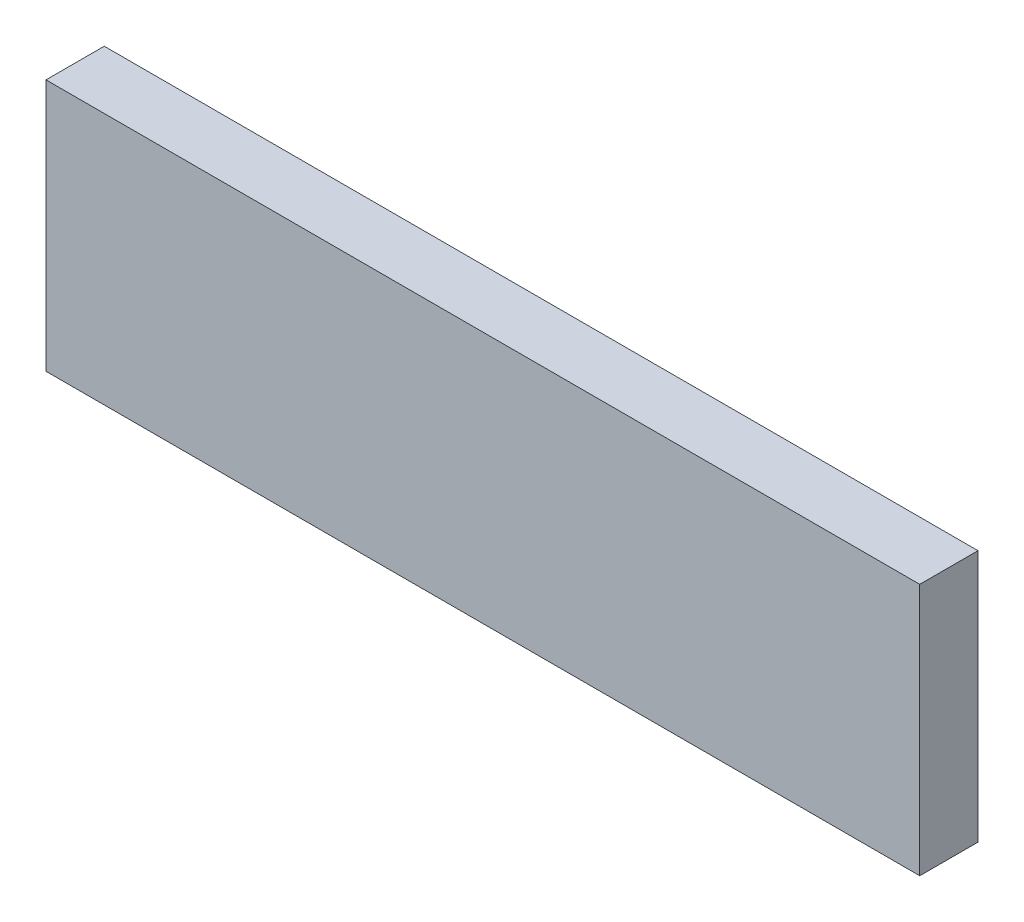
ISO-10303-21;
HEADER;
FILE_DESCRIPTION(('STEP AP214'),'2;1');
FILE_NAME('part.step','',(''),(''),'','','');
FILE_SCHEMA(('AUTOMOTIVE_DESIGN { 1 0 10303 214 1 1 1 1 }'));
ENDSEC;
DATA;
#1=APPLICATION_CONTEXT('core data for automotive mechanical design processes');
#2=APPLICATION_PROTOCOL_DEFINITION('international standard','automotive_design',2000,#1);
#3=PRODUCT_CONTEXT('',#1,'mechanical');
#4=PRODUCT('Part','Part','',(#3));
#5=PRODUCT_RELATED_PRODUCT_CATEGORY('part','',(#4));
#6=PRODUCT_DEFINITION_FORMATION('','',#4);
#7=PRODUCT_DEFINITION_CONTEXT('part definition',#1,'design');
#8=PRODUCT_DEFINITION('design','',#6,#7);
#9=PRODUCT_DEFINITION_SHAPE('','',#8);
#10=(LENGTH_UNIT() NAMED_UNIT(*) SI_UNIT(.MILLI.,.METRE.));
#11=(NAMED_UNIT(*) PLANE_ANGLE_UNIT() SI_UNIT($,.RADIAN.));
#12=(NAMED_UNIT(*) SI_UNIT($,.STERADIAN.) SOLID_ANGLE_UNIT());
#13=UNCERTAINTY_MEASURE_WITH_UNIT(LENGTH_MEASURE(1.E-05),#10,'distance_accuracy_value','');
#14=(GEOMETRIC_REPRESENTATION_CONTEXT(3) GLOBAL_UNCERTAINTY_ASSIGNED_CONTEXT((#13)) GLOBAL_UNIT_ASSIGNED_CONTEXT((#10,
#11,#12)) REPRESENTATION_CONTEXT('',''));
#15=CARTESIAN_POINT('',(0.,0.,0.));
#16=DIRECTION('',(0.,0.,1.));
#17=DIRECTION('',(1.,0.,0.));
#18=AXIS2_PLACEMENT_3D('',#15,#16,#17);
#19=CARTESIAN_POINT('',(0.,0.,3.));
#20=DIRECTION('',(1.,0.,0.));
#21=DIRECTION('',(0.,0.,-1.));
#22=AXIS2_PLACEMENT_3D('',#19,#20,#21);
#23=PLANE('',#22);
#24=DIRECTION('',(0.,-1.,0.));
#25=VECTOR('',#24,1.);
#26=CARTESIAN_POINT('',(0.,0.,0.));
#27=LINE('',#26,#25);
#28=CARTESIAN_POINT('',(0.,13.,0.));
#29=VERTEX_POINT('',#28);
#30=CARTESIAN_POINT('',(0.,0.,0.));
#31=VERTEX_POINT('',#30);
#32=EDGE_CURVE('E98',#29,#31,#27,.T.);
#33=ORIENTED_EDGE('',*,*,#32,.T.);
#34=DIRECTION('',(0.,0.,-1.));
#35=VECTOR('',#34,1.);
#36=CARTESIAN_POINT('',(0.,0.,3.));
#37=LINE('',#36,#35);
#38=CARTESIAN_POINT('',(0.,0.,3.));
#39=VERTEX_POINT('',#38);
#40=EDGE_CURVE('E11',#39,#31,#37,.T.);
#41=ORIENTED_EDGE('',*,*,#40,.F.);
#42=DIRECTION('',(0.,-1.,0.));
#43=VECTOR('',#42,1.);
#44=CARTESIAN_POINT('',(0.,0.,3.));
#45=LINE('',#44,#43);
#46=CARTESIAN_POINT('',(0.,13.,3.));
#47=VERTEX_POINT('',#46);
#48=EDGE_CURVE('E86',#47,#39,#45,.T.);
#49=ORIENTED_EDGE('',*,*,#48,.F.);
#50=DIRECTION('',(0.,0.,-1.));
#51=VECTOR('',#50,1.);
#52=CARTESIAN_POINT('',(0.,13.,3.));
#53=LINE('',#52,#51);
#54=EDGE_CURVE('E94',#47,#29,#53,.T.);
#55=ORIENTED_EDGE('',*,*,#54,.T.);
#56=EDGE_LOOP('',(#33,#41,#49,#55));
#57=FACE_BOUND('',#56,.T.);
#58=ADVANCED_FACE('F35',(#57),#23,.F.);
#59=CARTESIAN_POINT('',(0.,0.,3.));
#60=DIRECTION('',(0.,1.,0.));
#61=DIRECTION('',(0.,0.,1.));
#62=AXIS2_PLACEMENT_3D('',#59,#60,#61);
#63=PLANE('',#62);
#64=DIRECTION('',(1.,0.,0.));
#65=VECTOR('',#64,1.);
#66=CARTESIAN_POINT('',(0.,0.,0.));
#67=LINE('',#66,#65);
#68=CARTESIAN_POINT('',(45.,0.,0.));
#69=VERTEX_POINT('',#68);
#70=EDGE_CURVE('E90',#31,#69,#67,.T.);
#71=ORIENTED_EDGE('',*,*,#70,.T.);
#72=DIRECTION('',(0.,0.,-1.));
#73=VECTOR('',#72,1.);
#74=CARTESIAN_POINT('',(45.,0.,3.));
#75=LINE('',#74,#73);
#76=CARTESIAN_POINT('',(45.,0.,3.));
#77=VERTEX_POINT('',#76);
#78=EDGE_CURVE('E43',#77,#69,#75,.T.);
#79=ORIENTED_EDGE('',*,*,#78,.F.);
#80=DIRECTION('',(1.,0.,0.));
#81=VECTOR('',#80,1.);
#82=CARTESIAN_POINT('',(0.,0.,3.));
#83=LINE('',#82,#81);
#84=EDGE_CURVE('E81',#39,#77,#83,.T.);
#85=ORIENTED_EDGE('',*,*,#84,.F.);
#86=ORIENTED_EDGE('',*,*,#40,.T.);
#87=EDGE_LOOP('',(#71,#79,#85,#86));
#88=FACE_BOUND('',#87,.T.);
#89=ADVANCED_FACE('F89',(#88),#63,.F.);
#90=CARTESIAN_POINT('',(45.,0.,3.));
#91=DIRECTION('',(-1.,0.,0.));
#92=DIRECTION('',(0.,0.,1.));
#93=AXIS2_PLACEMENT_3D('',#90,#91,#92);
#94=PLANE('',#93);
#95=DIRECTION('',(0.,1.,0.));
#96=VECTOR('',#95,1.);
#97=CARTESIAN_POINT('',(45.,0.,0.));
#98=LINE('',#97,#96);
#99=CARTESIAN_POINT('',(45.,13.,0.));
#100=VERTEX_POINT('',#99);
#101=EDGE_CURVE('E68',#69,#100,#98,.T.);
#102=ORIENTED_EDGE('',*,*,#101,.T.);
#103=DIRECTION('',(0.,0.,-1.));
#104=VECTOR('',#103,1.);
#105=CARTESIAN_POINT('',(45.,13.,3.));
#106=LINE('',#105,#104);
#107=CARTESIAN_POINT('',(45.,13.,3.));
#108=VERTEX_POINT('',#107);
#109=EDGE_CURVE('E91',#108,#100,#106,.T.);
#110=ORIENTED_EDGE('',*,*,#109,.F.);
#111=DIRECTION('',(0.,1.,0.));
#112=VECTOR('',#111,1.);
#113=CARTESIAN_POINT('',(45.,0.,3.));
#114=LINE('',#113,#112);
#115=EDGE_CURVE('E84',#77,#108,#114,.T.);
#116=ORIENTED_EDGE('',*,*,#115,.F.);
#117=ORIENTED_EDGE('',*,*,#78,.T.);
#118=EDGE_LOOP('',(#102,#110,#116,#117));
#119=FACE_BOUND('',#118,.T.);
#120=ADVANCED_FACE('F92',(#119),#94,.F.);
#121=CARTESIAN_POINT('',(0.,13.,3.));
#122=DIRECTION('',(0.,-1.,0.));
#123=DIRECTION('',(0.,0.,-1.));
#124=AXIS2_PLACEMENT_3D('',#121,#122,#123);
#125=PLANE('',#124);
#126=DIRECTION('',(-1.,0.,0.));
#127=VECTOR('',#126,1.);
#128=CARTESIAN_POINT('',(0.,13.,0.));
#129=LINE('',#128,#127);
#130=EDGE_CURVE('E74',#100,#29,#129,.T.);
#131=ORIENTED_EDGE('',*,*,#130,.T.);
#132=ORIENTED_EDGE('',*,*,#54,.F.);
#133=DIRECTION('',(-1.,0.,0.));
#134=VECTOR('',#133,1.);
#135=CARTESIAN_POINT('',(0.,13.,3.));
#136=LINE('',#135,#134);
#137=EDGE_CURVE('E51',#108,#47,#136,.T.);
#138=ORIENTED_EDGE('',*,*,#137,.F.);
#139=ORIENTED_EDGE('',*,*,#109,.T.);
#140=EDGE_LOOP('',(#131,#132,#138,#139));
#141=FACE_BOUND('',#140,.T.);
#142=ADVANCED_FACE('F105',(#141),#125,.F.);
#143=CARTESIAN_POINT('',(0.,0.,3.));
#144=DIRECTION('',(0.,0.,-1.));
#145=DIRECTION('',(-1.,0.,0.));
#146=AXIS2_PLACEMENT_3D('',#143,#144,#145);
#147=PLANE('',#146);
#148=ORIENTED_EDGE('',*,*,#48,.T.);
#149=ORIENTED_EDGE('',*,*,#84,.T.);
#150=ORIENTED_EDGE('',*,*,#115,.T.);
#151=ORIENTED_EDGE('',*,*,#137,.T.);
#152=EDGE_LOOP('',(#148,#149,#150,#151));
#153=FACE_BOUND('',#152,.T.);
#154=ADVANCED_FACE('F82',(#153),#147,.F.);
#155=CARTESIAN_POINT('',(0.,0.,0.));
#156=DIRECTION('',(0.,0.,-1.));
#157=DIRECTION('',(-1.,0.,0.));
#158=AXIS2_PLACEMENT_3D('',#155,#156,#157);
#159=PLANE('',#158);
#160=ORIENTED_EDGE('',*,*,#32,.F.);
#161=ORIENTED_EDGE('',*,*,#130,.F.);
#162=ORIENTED_EDGE('',*,*,#101,.F.);
#163=ORIENTED_EDGE('',*,*,#70,.F.);
#164=EDGE_LOOP('',(#160,#161,#162,#163));
#165=FACE_BOUND('',#164,.T.);
#166=ADVANCED_FACE('F108',(#165),#159,.T.);
#167=CLOSED_SHELL('',(#58,#89,#120,#142,#154,#166));
#168=MANIFOLD_SOLID_BREP('B2',#167);
#169=ADVANCED_BREP_SHAPE_REPRESENTATION('',(#18,#168),#14);
#170=SHAPE_DEFINITION_REPRESENTATION(#9,#169);
ENDSEC;
END-ISO-10303-21;
